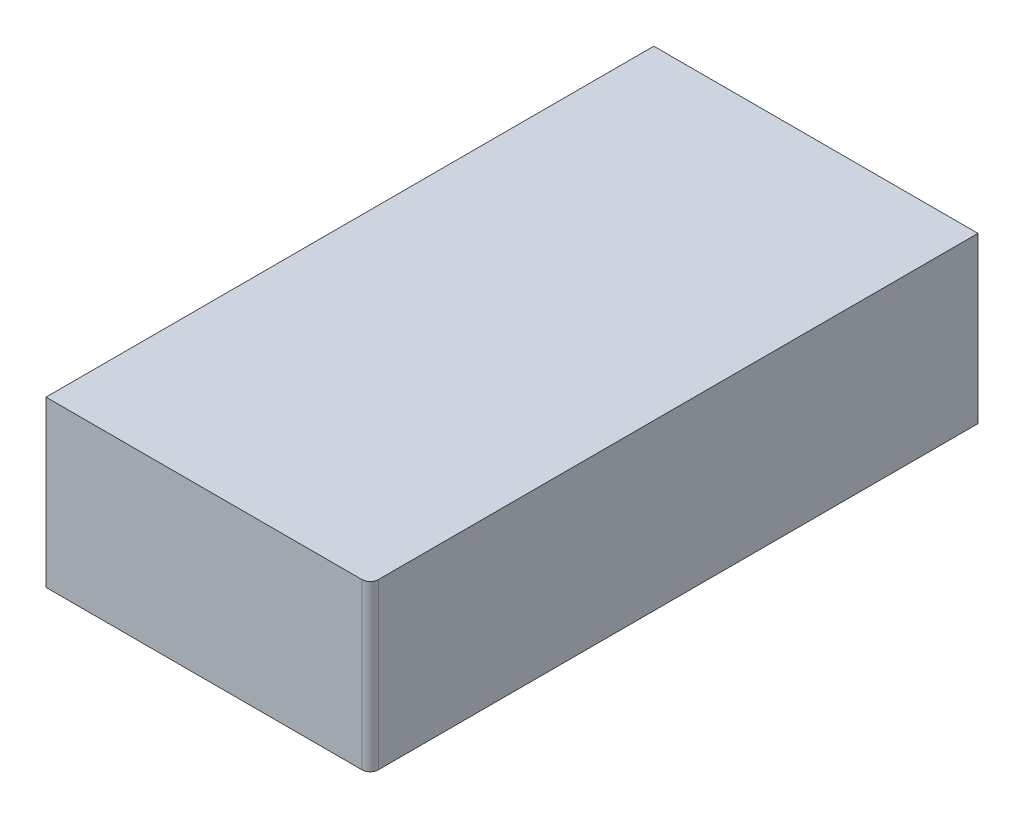
ISO-10303-21;
HEADER;
FILE_DESCRIPTION(('STEP AP214'),'2;1');
FILE_NAME('part.step','',(''),(''),'','','');
FILE_SCHEMA(('AUTOMOTIVE_DESIGN { 1 0 10303 214 1 1 1 1 }'));
ENDSEC;
DATA;
#1=APPLICATION_CONTEXT('core data for automotive mechanical design processes');
#2=APPLICATION_PROTOCOL_DEFINITION('international standard','automotive_design',2000,#1);
#3=PRODUCT_CONTEXT('',#1,'mechanical');
#4=PRODUCT('Part','Part','',(#3));
#5=PRODUCT_RELATED_PRODUCT_CATEGORY('part','',(#4));
#6=PRODUCT_DEFINITION_FORMATION('','',#4);
#7=PRODUCT_DEFINITION_CONTEXT('part definition',#1,'design');
#8=PRODUCT_DEFINITION('design','',#6,#7);
#9=PRODUCT_DEFINITION_SHAPE('','',#8);
#10=(LENGTH_UNIT() NAMED_UNIT(*) SI_UNIT(.MILLI.,.METRE.));
#11=(NAMED_UNIT(*) PLANE_ANGLE_UNIT() SI_UNIT($,.RADIAN.));
#12=(NAMED_UNIT(*) SI_UNIT($,.STERADIAN.) SOLID_ANGLE_UNIT());
#13=UNCERTAINTY_MEASURE_WITH_UNIT(LENGTH_MEASURE(1.E-05),#10,'distance_accuracy_value','');
#14=(GEOMETRIC_REPRESENTATION_CONTEXT(3) GLOBAL_UNCERTAINTY_ASSIGNED_CONTEXT((#13)) GLOBAL_UNIT_ASSIGNED_CONTEXT((#10,
#11,#12)) REPRESENTATION_CONTEXT('',''));
#15=CARTESIAN_POINT('',(0.,0.,0.));
#16=DIRECTION('',(0.,0.,1.));
#17=DIRECTION('',(1.,0.,0.));
#18=AXIS2_PLACEMENT_3D('',#15,#16,#17);
#19=CARTESIAN_POINT('',(425.,0.,-449.614263731597));
#20=DIRECTION('',(1.,0.,0.));
#21=DIRECTION('',(0.,0.,-1.));
#22=AXIS2_PLACEMENT_3D('',#19,#20,#21);
#23=PLANE('',#22);
#24=DIRECTION('',(0.,0.,1.));
#25=VECTOR('',#24,1.);
#26=CARTESIAN_POINT('',(425.,0.,-449.614263731597));
#27=LINE('',#26,#25);
#28=CARTESIAN_POINT('',(425.,0.,-225.));
#29=VERTEX_POINT('',#28);
#30=CARTESIAN_POINT('',(425.,0.,-3.));
#31=VERTEX_POINT('',#30);
#32=EDGE_CURVE('E103',#29,#31,#27,.T.);
#33=ORIENTED_EDGE('',*,*,#32,.T.);
#34=DIRECTION('',(0.,1.,0.));
#35=VECTOR('',#34,1.);
#36=CARTESIAN_POINT('',(425.,-61.,-3.));
#37=LINE('',#36,#35);
#38=CARTESIAN_POINT('',(425.,-61.,-3.));
#39=VERTEX_POINT('',#38);
#40=EDGE_CURVE('E46',#31,#39,#37,.F.);
#41=ORIENTED_EDGE('',*,*,#40,.T.);
#42=DIRECTION('',(0.,0.,1.));
#43=VECTOR('',#42,1.);
#44=CARTESIAN_POINT('',(425.,-61.,-449.614263731597));
#45=LINE('',#44,#43);
#46=CARTESIAN_POINT('',(425.,-61.,-225.));
#47=VERTEX_POINT('',#46);
#48=EDGE_CURVE('E112',#47,#39,#45,.T.);
#49=ORIENTED_EDGE('',*,*,#48,.F.);
#50=DIRECTION('',(0.,-1.,0.));
#51=VECTOR('',#50,1.);
#52=CARTESIAN_POINT('',(425.,0.,-225.));
#53=LINE('',#52,#51);
#54=EDGE_CURVE('E118',#29,#47,#53,.T.);
#55=ORIENTED_EDGE('',*,*,#54,.F.);
#56=EDGE_LOOP('',(#33,#41,#49,#55));
#57=FACE_BOUND('',#56,.T.);
#58=ADVANCED_FACE('F38',(#57),#23,.T.);
#59=CARTESIAN_POINT('',(425.,-61.,-449.614263731597));
#60=DIRECTION('',(0.,-1.,0.));
#61=DIRECTION('',(1.,0.,0.));
#62=AXIS2_PLACEMENT_3D('',#59,#60,#61);
#63=PLANE('',#62);
#64=ORIENTED_EDGE('',*,*,#48,.T.);
#65=CARTESIAN_POINT('',(422.,-61.,-3.));
#66=DIRECTION('',(0.,-1.,0.));
#67=DIRECTION('',(1.,0.,0.));
#68=AXIS2_PLACEMENT_3D('',#65,#66,#67);
#69=CIRCLE('',#68,3.);
#70=CARTESIAN_POINT('',(422.,-61.,0.));
#71=VERTEX_POINT('',#70);
#72=EDGE_CURVE('E11',#39,#71,#69,.T.);
#73=ORIENTED_EDGE('',*,*,#72,.T.);
#74=DIRECTION('',(1.,0.,0.));
#75=VECTOR('',#74,1.);
#76=CARTESIAN_POINT('',(425.,-61.,0.));
#77=LINE('',#76,#75);
#78=CARTESIAN_POINT('',(305.,-61.,0.));
#79=VERTEX_POINT('',#78);
#80=EDGE_CURVE('E107',#79,#71,#77,.T.);
#81=ORIENTED_EDGE('',*,*,#80,.F.);
#82=DIRECTION('',(0.,0.,1.));
#83=VECTOR('',#82,1.);
#84=CARTESIAN_POINT('',(305.,-61.,-449.614263731597));
#85=LINE('',#84,#83);
#86=CARTESIAN_POINT('',(305.,-61.,-225.));
#87=VERTEX_POINT('',#86);
#88=EDGE_CURVE('E102',#87,#79,#85,.T.);
#89=ORIENTED_EDGE('',*,*,#88,.F.);
#90=DIRECTION('',(-1.,0.,0.));
#91=VECTOR('',#90,1.);
#92=CARTESIAN_POINT('',(425.,-61.,-225.));
#93=LINE('',#92,#91);
#94=EDGE_CURVE('E122',#47,#87,#93,.T.);
#95=ORIENTED_EDGE('',*,*,#94,.F.);
#96=EDGE_LOOP('',(#64,#73,#81,#89,#95));
#97=FACE_BOUND('',#96,.T.);
#98=ADVANCED_FACE('F128',(#97),#63,.T.);
#99=CARTESIAN_POINT('',(305.,0.,-449.614263731597));
#100=DIRECTION('',(-1.,0.,0.));
#101=DIRECTION('',(0.,0.,1.));
#102=AXIS2_PLACEMENT_3D('',#99,#100,#101);
#103=PLANE('',#102);
#104=DIRECTION('',(0.,1.,0.));
#105=VECTOR('',#104,1.);
#106=CARTESIAN_POINT('',(305.,0.,-225.));
#107=LINE('',#106,#105);
#108=CARTESIAN_POINT('',(305.,0.,-225.));
#109=VERTEX_POINT('',#108);
#110=EDGE_CURVE('E114',#87,#109,#107,.T.);
#111=ORIENTED_EDGE('',*,*,#110,.F.);
#112=ORIENTED_EDGE('',*,*,#88,.T.);
#113=DIRECTION('',(0.,-1.,0.));
#114=VECTOR('',#113,1.);
#115=CARTESIAN_POINT('',(305.,0.,0.));
#116=LINE('',#115,#114);
#117=CARTESIAN_POINT('',(305.,0.,0.));
#118=VERTEX_POINT('',#117);
#119=EDGE_CURVE('E90',#118,#79,#116,.T.);
#120=ORIENTED_EDGE('',*,*,#119,.F.);
#121=DIRECTION('',(0.,0.,1.));
#122=VECTOR('',#121,1.);
#123=CARTESIAN_POINT('',(305.,0.,-449.614263731597));
#124=LINE('',#123,#122);
#125=EDGE_CURVE('E97',#109,#118,#124,.T.);
#126=ORIENTED_EDGE('',*,*,#125,.F.);
#127=EDGE_LOOP('',(#111,#112,#120,#126));
#128=FACE_BOUND('',#127,.T.);
#129=ADVANCED_FACE('F105',(#128),#103,.T.);
#130=CARTESIAN_POINT('',(425.,0.,-449.614263731597));
#131=DIRECTION('',(0.,1.,0.));
#132=DIRECTION('',(0.,0.,1.));
#133=AXIS2_PLACEMENT_3D('',#130,#131,#132);
#134=PLANE('',#133);
#135=DIRECTION('',(-1.,0.,0.));
#136=VECTOR('',#135,1.);
#137=CARTESIAN_POINT('',(425.,0.,0.));
#138=LINE('',#137,#136);
#139=CARTESIAN_POINT('',(422.,0.,0.));
#140=VERTEX_POINT('',#139);
#141=EDGE_CURVE('E85',#140,#118,#138,.T.);
#142=ORIENTED_EDGE('',*,*,#141,.F.);
#143=CARTESIAN_POINT('',(422.,0.,-3.));
#144=DIRECTION('',(0.,1.,0.));
#145=DIRECTION('',(0.,0.,1.));
#146=AXIS2_PLACEMENT_3D('',#143,#144,#145);
#147=CIRCLE('',#146,3.);
#148=EDGE_CURVE('E60',#140,#31,#147,.T.);
#149=ORIENTED_EDGE('',*,*,#148,.T.);
#150=ORIENTED_EDGE('',*,*,#32,.F.);
#151=DIRECTION('',(1.,0.,0.));
#152=VECTOR('',#151,1.);
#153=CARTESIAN_POINT('',(425.,0.,-225.));
#154=LINE('',#153,#152);
#155=EDGE_CURVE('E99',#109,#29,#154,.T.);
#156=ORIENTED_EDGE('',*,*,#155,.F.);
#157=ORIENTED_EDGE('',*,*,#125,.T.);
#158=EDGE_LOOP('',(#142,#149,#150,#156,#157));
#159=FACE_BOUND('',#158,.T.);
#160=ADVANCED_FACE('F98',(#159),#134,.T.);
#161=CARTESIAN_POINT('',(0.,0.,0.));
#162=DIRECTION('',(0.,0.,-1.));
#163=DIRECTION('',(-1.,0.,0.));
#164=AXIS2_PLACEMENT_3D('',#161,#162,#163);
#165=PLANE('',#164);
#166=ORIENTED_EDGE('',*,*,#80,.T.);
#167=DIRECTION('',(0.,1.,0.));
#168=VECTOR('',#167,1.);
#169=CARTESIAN_POINT('',(422.,0.,0.));
#170=LINE('',#169,#168);
#171=EDGE_CURVE('E93',#71,#140,#170,.T.);
#172=ORIENTED_EDGE('',*,*,#171,.T.);
#173=ORIENTED_EDGE('',*,*,#141,.T.);
#174=ORIENTED_EDGE('',*,*,#119,.T.);
#175=EDGE_LOOP('',(#166,#172,#173,#174));
#176=FACE_BOUND('',#175,.T.);
#177=ADVANCED_FACE('F88',(#176),#165,.F.);
#178=CARTESIAN_POINT('',(-355.,30.,-225.));
#179=DIRECTION('',(0.,0.,1.));
#180=DIRECTION('',(1.,0.,0.));
#181=AXIS2_PLACEMENT_3D('',#178,#179,#180);
#182=PLANE('',#181);
#183=ORIENTED_EDGE('',*,*,#54,.T.);
#184=ORIENTED_EDGE('',*,*,#94,.T.);
#185=ORIENTED_EDGE('',*,*,#110,.T.);
#186=ORIENTED_EDGE('',*,*,#155,.T.);
#187=EDGE_LOOP('',(#183,#184,#185,#186));
#188=FACE_BOUND('',#187,.T.);
#189=ADVANCED_FACE('F126',(#188),#182,.F.);
#190=CARTESIAN_POINT('',(422.,0.,-3.));
#191=DIRECTION('',(0.,-1.,0.));
#192=DIRECTION('',(0.,0.,-1.));
#193=AXIS2_PLACEMENT_3D('',#190,#191,#192);
#194=CYLINDRICAL_SURFACE('',#193,3.);
#195=ORIENTED_EDGE('',*,*,#72,.F.);
#196=ORIENTED_EDGE('',*,*,#40,.F.);
#197=ORIENTED_EDGE('',*,*,#148,.F.);
#198=ORIENTED_EDGE('',*,*,#171,.F.);
#199=EDGE_LOOP('',(#195,#196,#197,#198));
#200=FACE_BOUND('',#199,.T.);
#201=ADVANCED_FACE('F40',(#200),#194,.T.);
#202=CLOSED_SHELL('',(#58,#98,#129,#160,#177,#189,#201));
#203=MANIFOLD_SOLID_BREP('B2',#202);
#204=ADVANCED_BREP_SHAPE_REPRESENTATION('',(#18,#203),#14);
#205=SHAPE_DEFINITION_REPRESENTATION(#9,#204);
ENDSEC;
END-ISO-10303-21;
